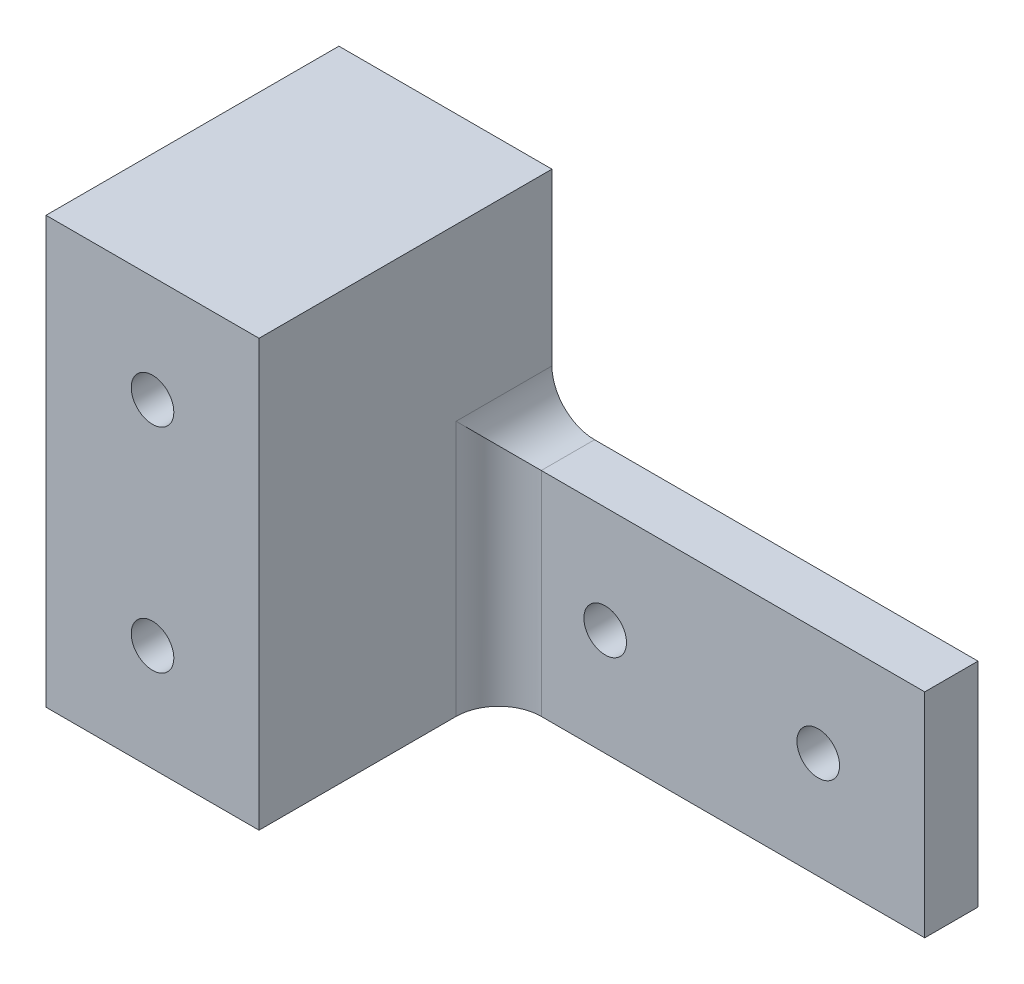
ISO-10303-21;
HEADER;
FILE_DESCRIPTION(('STEP AP214'),'2;1');
FILE_NAME('part.step','',(''),(''),'','','');
FILE_SCHEMA(('AUTOMOTIVE_DESIGN { 1 0 10303 214 1 1 1 1 }'));
ENDSEC;
DATA;
#1=APPLICATION_CONTEXT('core data for automotive mechanical design processes');
#2=APPLICATION_PROTOCOL_DEFINITION('international standard','automotive_design',2000,#1);
#3=PRODUCT_CONTEXT('',#1,'mechanical');
#4=PRODUCT('Part','Part','',(#3));
#5=PRODUCT_RELATED_PRODUCT_CATEGORY('part','',(#4));
#6=PRODUCT_DEFINITION_FORMATION('','',#4);
#7=PRODUCT_DEFINITION_CONTEXT('part definition',#1,'design');
#8=PRODUCT_DEFINITION('design','',#6,#7);
#9=PRODUCT_DEFINITION_SHAPE('','',#8);
#10=(LENGTH_UNIT() NAMED_UNIT(*) SI_UNIT(.MILLI.,.METRE.));
#11=(NAMED_UNIT(*) PLANE_ANGLE_UNIT() SI_UNIT($,.RADIAN.));
#12=(NAMED_UNIT(*) SI_UNIT($,.STERADIAN.) SOLID_ANGLE_UNIT());
#13=UNCERTAINTY_MEASURE_WITH_UNIT(LENGTH_MEASURE(1.E-05),#10,'distance_accuracy_value','');
#14=(GEOMETRIC_REPRESENTATION_CONTEXT(3) GLOBAL_UNCERTAINTY_ASSIGNED_CONTEXT((#13)) GLOBAL_UNIT_ASSIGNED_CONTEXT((#10,
#11,#12)) REPRESENTATION_CONTEXT('',''));
#15=CARTESIAN_POINT('',(0.,0.,0.));
#16=DIRECTION('',(0.,0.,1.));
#17=DIRECTION('',(1.,0.,0.));
#18=AXIS2_PLACEMENT_3D('',#15,#16,#17);
#19=CARTESIAN_POINT('',(12.7,38.1,0.));
#20=DIRECTION('',(0.,0.,1.));
#21=DIRECTION('',(1.,0.,0.));
#22=AXIS2_PLACEMENT_3D('',#19,#20,#21);
#23=CYLINDRICAL_SURFACE('',#22,2.54);
#24=CARTESIAN_POINT('',(12.7,38.1,34.925));
#25=DIRECTION('',(0.,0.,1.));
#26=DIRECTION('',(1.,0.,0.));
#27=AXIS2_PLACEMENT_3D('',#24,#25,#26);
#28=CIRCLE('',#27,2.54);
#29=CARTESIAN_POINT('',(15.24,38.1,34.925));
#30=VERTEX_POINT('',#29);
#31=EDGE_CURVE('E158',#30,#30,#28,.T.);
#32=ORIENTED_EDGE('',*,*,#31,.T.);
#33=EDGE_LOOP('',(#32));
#34=FACE_BOUND('',#33,.T.);
#35=CARTESIAN_POINT('',(12.7,38.1,22.225));
#36=DIRECTION('',(0.,0.,-1.));
#37=DIRECTION('',(-1.,0.,0.));
#38=AXIS2_PLACEMENT_3D('',#35,#36,#37);
#39=CIRCLE('',#38,2.54);
#40=CARTESIAN_POINT('',(10.16,38.1,22.225));
#41=VERTEX_POINT('',#40);
#42=EDGE_CURVE('E43',#41,#41,#39,.F.);
#43=ORIENTED_EDGE('',*,*,#42,.F.);
#44=EDGE_LOOP('',(#43));
#45=FACE_BOUND('',#44,.T.);
#46=ADVANCED_FACE('F39',(#34,#45),#23,.F.);
#47=CARTESIAN_POINT('',(76.2,0.,34.925));
#48=DIRECTION('',(0.,1.,0.));
#49=DIRECTION('',(-1.,0.,0.));
#50=AXIS2_PLACEMENT_3D('',#47,#48,#49);
#51=PLANE('',#50);
#52=DIRECTION('',(0.,0.,-1.));
#53=VECTOR('',#52,1.);
#54=CARTESIAN_POINT('',(76.2,0.,34.925));
#55=LINE('',#54,#53);
#56=CARTESIAN_POINT('',(76.2,0.,6.35));
#57=VERTEX_POINT('',#56);
#58=CARTESIAN_POINT('',(76.2,0.,0.));
#59=VERTEX_POINT('',#58);
#60=EDGE_CURVE('E181',#57,#59,#55,.T.);
#61=ORIENTED_EDGE('',*,*,#60,.F.);
#62=DIRECTION('',(1.,0.,0.));
#63=VECTOR('',#62,1.);
#64=CARTESIAN_POINT('',(76.2,0.,6.35));
#65=LINE('',#64,#63);
#66=CARTESIAN_POINT('',(30.48,0.,6.34999999999999));
#67=VERTEX_POINT('',#66);
#68=EDGE_CURVE('E131',#67,#57,#65,.T.);
#69=ORIENTED_EDGE('',*,*,#68,.F.);
#70=CARTESIAN_POINT('',(30.48,0.,11.43));
#71=DIRECTION('',(0.,1.,0.));
#72=DIRECTION('',(-1.,0.,0.));
#73=AXIS2_PLACEMENT_3D('',#70,#71,#72);
#74=CIRCLE('',#73,5.08);
#75=CARTESIAN_POINT('',(25.4,0.,11.43));
#76=VERTEX_POINT('',#75);
#77=EDGE_CURVE('E11',#67,#76,#74,.T.);
#78=ORIENTED_EDGE('',*,*,#77,.T.);
#79=DIRECTION('',(0.,0.,-1.));
#80=VECTOR('',#79,1.);
#81=CARTESIAN_POINT('',(25.4,0.,34.925));
#82=LINE('',#81,#80);
#83=CARTESIAN_POINT('',(25.4,0.,34.925));
#84=VERTEX_POINT('',#83);
#85=EDGE_CURVE('E113',#84,#76,#82,.T.);
#86=ORIENTED_EDGE('',*,*,#85,.F.);
#87=DIRECTION('',(1.,0.,0.));
#88=VECTOR('',#87,1.);
#89=CARTESIAN_POINT('',(76.2,0.,34.925));
#90=LINE('',#89,#88);
#91=CARTESIAN_POINT('',(0.,0.,34.925));
#92=VERTEX_POINT('',#91);
#93=EDGE_CURVE('E122',#92,#84,#90,.T.);
#94=ORIENTED_EDGE('',*,*,#93,.F.);
#95=DIRECTION('',(0.,0.,-1.));
#96=VECTOR('',#95,1.);
#97=CARTESIAN_POINT('',(0.,0.,34.925));
#98=LINE('',#97,#96);
#99=CARTESIAN_POINT('',(0.,0.,0.));
#100=VERTEX_POINT('',#99);
#101=EDGE_CURVE('E152',#92,#100,#98,.T.);
#102=ORIENTED_EDGE('',*,*,#101,.T.);
#103=DIRECTION('',(1.,0.,0.));
#104=VECTOR('',#103,1.);
#105=CARTESIAN_POINT('',(76.2,0.,0.));
#106=LINE('',#105,#104);
#107=EDGE_CURVE('E153',#100,#59,#106,.T.);
#108=ORIENTED_EDGE('',*,*,#107,.T.);
#109=EDGE_LOOP('',(#61,#69,#78,#86,#94,#102,#108));
#110=FACE_BOUND('',#109,.T.);
#111=ADVANCED_FACE('F127',(#110),#51,.F.);
#112=CARTESIAN_POINT('',(76.2,25.4,34.925));
#113=DIRECTION('',(-1.,0.,0.));
#114=DIRECTION('',(0.,0.,1.));
#115=AXIS2_PLACEMENT_3D('',#112,#113,#114);
#116=PLANE('',#115);
#117=DIRECTION('',(0.,0.,-1.));
#118=VECTOR('',#117,1.);
#119=CARTESIAN_POINT('',(76.2,25.4,34.925));
#120=LINE('',#119,#118);
#121=CARTESIAN_POINT('',(76.2,25.4,6.35));
#122=VERTEX_POINT('',#121);
#123=CARTESIAN_POINT('',(76.2,25.4,0.));
#124=VERTEX_POINT('',#123);
#125=EDGE_CURVE('E178',#122,#124,#120,.T.);
#126=ORIENTED_EDGE('',*,*,#125,.F.);
#127=DIRECTION('',(0.,-1.,0.));
#128=VECTOR('',#127,1.);
#129=CARTESIAN_POINT('',(76.2,50.8,6.35));
#130=LINE('',#129,#128);
#131=EDGE_CURVE('E190',#122,#57,#130,.T.);
#132=ORIENTED_EDGE('',*,*,#131,.T.);
#133=ORIENTED_EDGE('',*,*,#60,.T.);
#134=DIRECTION('',(0.,1.,0.));
#135=VECTOR('',#134,1.);
#136=CARTESIAN_POINT('',(76.2,25.4,0.));
#137=LINE('',#136,#135);
#138=EDGE_CURVE('E157',#59,#124,#137,.T.);
#139=ORIENTED_EDGE('',*,*,#138,.T.);
#140=EDGE_LOOP('',(#126,#132,#133,#139));
#141=FACE_BOUND('',#140,.T.);
#142=ADVANCED_FACE('F277',(#141),#116,.F.);
#143=CARTESIAN_POINT('',(25.4,25.4,34.925));
#144=DIRECTION('',(0.,-1.,0.));
#145=DIRECTION('',(1.,0.,0.));
#146=AXIS2_PLACEMENT_3D('',#143,#144,#145);
#147=PLANE('',#146);
#148=DIRECTION('',(-1.,0.,0.));
#149=VECTOR('',#148,1.);
#150=CARTESIAN_POINT('',(25.4,25.4,0.));
#151=LINE('',#150,#149);
#152=CARTESIAN_POINT('',(30.48,25.4,0.));
#153=VERTEX_POINT('',#152);
#154=EDGE_CURVE('E162',#124,#153,#151,.T.);
#155=ORIENTED_EDGE('',*,*,#154,.T.);
#156=DIRECTION('',(0.,0.,-1.));
#157=VECTOR('',#156,1.);
#158=CARTESIAN_POINT('',(30.48,25.4,6.34999999999999));
#159=LINE('',#158,#157);
#160=CARTESIAN_POINT('',(30.48,25.4,6.34999999999999));
#161=VERTEX_POINT('',#160);
#162=EDGE_CURVE('E197',#153,#161,#159,.F.);
#163=ORIENTED_EDGE('',*,*,#162,.T.);
#164=DIRECTION('',(1.,0.,0.));
#165=VECTOR('',#164,1.);
#166=CARTESIAN_POINT('',(25.4,25.4,6.34999999999999));
#167=LINE('',#166,#165);
#168=EDGE_CURVE('E232',#161,#122,#167,.T.);
#169=ORIENTED_EDGE('',*,*,#168,.T.);
#170=ORIENTED_EDGE('',*,*,#125,.T.);
#171=EDGE_LOOP('',(#155,#163,#169,#170));
#172=FACE_BOUND('',#171,.T.);
#173=ADVANCED_FACE('F310',(#172),#147,.F.);
#174=CARTESIAN_POINT('',(25.4,50.8,34.925));
#175=DIRECTION('',(-1.,0.,0.));
#176=DIRECTION('',(0.,-1.,0.));
#177=AXIS2_PLACEMENT_3D('',#174,#175,#176);
#178=PLANE('',#177);
#179=DIRECTION('',(0.,-1.,0.));
#180=VECTOR('',#179,1.);
#181=CARTESIAN_POINT('',(25.4,25.4,11.43));
#182=LINE('',#181,#180);
#183=CARTESIAN_POINT('',(25.4,30.48,11.43));
#184=VERTEX_POINT('',#183);
#185=EDGE_CURVE('E184',#76,#184,#182,.F.);
#186=ORIENTED_EDGE('',*,*,#185,.T.);
#187=DIRECTION('',(0.,0.,-1.));
#188=VECTOR('',#187,1.);
#189=CARTESIAN_POINT('',(25.4,30.48,0.));
#190=LINE('',#189,#188);
#191=CARTESIAN_POINT('',(25.4,30.48,0.));
#192=VERTEX_POINT('',#191);
#193=EDGE_CURVE('E193',#184,#192,#190,.T.);
#194=ORIENTED_EDGE('',*,*,#193,.T.);
#195=DIRECTION('',(0.,1.,0.));
#196=VECTOR('',#195,1.);
#197=CARTESIAN_POINT('',(25.4,50.8,0.));
#198=LINE('',#197,#196);
#199=CARTESIAN_POINT('',(25.4,50.8,0.));
#200=VERTEX_POINT('',#199);
#201=EDGE_CURVE('E165',#192,#200,#198,.T.);
#202=ORIENTED_EDGE('',*,*,#201,.T.);
#203=DIRECTION('',(0.,0.,-1.));
#204=VECTOR('',#203,1.);
#205=CARTESIAN_POINT('',(25.4,50.8,34.925));
#206=LINE('',#205,#204);
#207=CARTESIAN_POINT('',(25.4,50.8,34.925));
#208=VERTEX_POINT('',#207);
#209=EDGE_CURVE('E116',#208,#200,#206,.T.);
#210=ORIENTED_EDGE('',*,*,#209,.F.);
#211=DIRECTION('',(0.,1.,0.));
#212=VECTOR('',#211,1.);
#213=CARTESIAN_POINT('',(25.4,50.8,34.925));
#214=LINE('',#213,#212);
#215=EDGE_CURVE('E110',#84,#208,#214,.T.);
#216=ORIENTED_EDGE('',*,*,#215,.F.);
#217=ORIENTED_EDGE('',*,*,#85,.T.);
#218=EDGE_LOOP('',(#186,#194,#202,#210,#216,#217));
#219=FACE_BOUND('',#218,.T.);
#220=ADVANCED_FACE('F112',(#219),#178,.F.);
#221=CARTESIAN_POINT('',(0.,50.8,34.925));
#222=DIRECTION('',(0.,-1.,0.));
#223=DIRECTION('',(0.,0.,-1.));
#224=AXIS2_PLACEMENT_3D('',#221,#222,#223);
#225=PLANE('',#224);
#226=DIRECTION('',(-1.,0.,0.));
#227=VECTOR('',#226,1.);
#228=CARTESIAN_POINT('',(0.,50.8,0.));
#229=LINE('',#228,#227);
#230=CARTESIAN_POINT('',(0.,50.8,0.));
#231=VERTEX_POINT('',#230);
#232=EDGE_CURVE('E142',#200,#231,#229,.T.);
#233=ORIENTED_EDGE('',*,*,#232,.T.);
#234=DIRECTION('',(0.,0.,-1.));
#235=VECTOR('',#234,1.);
#236=CARTESIAN_POINT('',(0.,50.8,34.925));
#237=LINE('',#236,#235);
#238=CARTESIAN_POINT('',(0.,50.8,34.925));
#239=VERTEX_POINT('',#238);
#240=EDGE_CURVE('E172',#239,#231,#237,.T.);
#241=ORIENTED_EDGE('',*,*,#240,.F.);
#242=DIRECTION('',(-1.,0.,0.));
#243=VECTOR('',#242,1.);
#244=CARTESIAN_POINT('',(0.,50.8,34.925));
#245=LINE('',#244,#243);
#246=EDGE_CURVE('E121',#208,#239,#245,.T.);
#247=ORIENTED_EDGE('',*,*,#246,.F.);
#248=ORIENTED_EDGE('',*,*,#209,.T.);
#249=EDGE_LOOP('',(#233,#241,#247,#248));
#250=FACE_BOUND('',#249,.T.);
#251=ADVANCED_FACE('F300',(#250),#225,.F.);
#252=CARTESIAN_POINT('',(0.,0.,34.925));
#253=DIRECTION('',(1.,0.,0.));
#254=DIRECTION('',(0.,0.,-1.));
#255=AXIS2_PLACEMENT_3D('',#252,#253,#254);
#256=PLANE('',#255);
#257=DIRECTION('',(0.,-1.,0.));
#258=VECTOR('',#257,1.);
#259=CARTESIAN_POINT('',(0.,0.,0.));
#260=LINE('',#259,#258);
#261=EDGE_CURVE('E139',#231,#100,#260,.T.);
#262=ORIENTED_EDGE('',*,*,#261,.T.);
#263=ORIENTED_EDGE('',*,*,#101,.F.);
#264=DIRECTION('',(0.,-1.,0.));
#265=VECTOR('',#264,1.);
#266=CARTESIAN_POINT('',(0.,0.,34.925));
#267=LINE('',#266,#265);
#268=EDGE_CURVE('E136',#239,#92,#267,.T.);
#269=ORIENTED_EDGE('',*,*,#268,.F.);
#270=ORIENTED_EDGE('',*,*,#240,.T.);
#271=EDGE_LOOP('',(#262,#263,#269,#270));
#272=FACE_BOUND('',#271,.T.);
#273=ADVANCED_FACE('F295',(#272),#256,.F.);
#274=CARTESIAN_POINT('',(0.,0.,34.925));
#275=DIRECTION('',(0.,0.,-1.));
#276=DIRECTION('',(-1.,0.,0.));
#277=AXIS2_PLACEMENT_3D('',#274,#275,#276);
#278=PLANE('',#277);
#279=ORIENTED_EDGE('',*,*,#31,.F.);
#280=EDGE_LOOP('',(#279));
#281=FACE_BOUND('',#280,.T.);
#282=CARTESIAN_POINT('',(12.7,12.7,34.925));
#283=DIRECTION('',(0.,0.,1.));
#284=DIRECTION('',(1.,0.,0.));
#285=AXIS2_PLACEMENT_3D('',#282,#283,#284);
#286=CIRCLE('',#285,2.54);
#287=CARTESIAN_POINT('',(15.24,12.7,34.925));
#288=VERTEX_POINT('',#287);
#289=EDGE_CURVE('E242',#288,#288,#286,.T.);
#290=ORIENTED_EDGE('',*,*,#289,.F.);
#291=EDGE_LOOP('',(#290));
#292=FACE_BOUND('',#291,.T.);
#293=ORIENTED_EDGE('',*,*,#93,.T.);
#294=ORIENTED_EDGE('',*,*,#215,.T.);
#295=ORIENTED_EDGE('',*,*,#246,.T.);
#296=ORIENTED_EDGE('',*,*,#268,.T.);
#297=EDGE_LOOP('',(#293,#294,#295,#296));
#298=FACE_BOUND('',#297,.T.);
#299=ADVANCED_FACE('F134',(#281,#292,#298),#278,.F.);
#300=CARTESIAN_POINT('',(0.,0.,0.));
#301=DIRECTION('',(0.,0.,-1.));
#302=DIRECTION('',(-1.,0.,0.));
#303=AXIS2_PLACEMENT_3D('',#300,#301,#302);
#304=PLANE('',#303);
#305=CARTESIAN_POINT('',(12.7,38.1,0.));
#306=DIRECTION('',(0.,0.,-1.));
#307=DIRECTION('',(-1.,0.,0.));
#308=AXIS2_PLACEMENT_3D('',#305,#306,#307);
#309=CIRCLE('',#308,6.35);
#310=CARTESIAN_POINT('',(6.35,38.1,0.));
#311=VERTEX_POINT('',#310);
#312=EDGE_CURVE('E216',#311,#311,#309,.T.);
#313=ORIENTED_EDGE('',*,*,#312,.F.);
#314=EDGE_LOOP('',(#313));
#315=FACE_BOUND('',#314,.T.);
#316=CARTESIAN_POINT('',(12.7,12.7,0.));
#317=DIRECTION('',(0.,0.,1.));
#318=DIRECTION('',(1.,0.,0.));
#319=AXIS2_PLACEMENT_3D('',#316,#317,#318);
#320=CIRCLE('',#319,2.54);
#321=CARTESIAN_POINT('',(15.24,12.7,0.));
#322=VERTEX_POINT('',#321);
#323=EDGE_CURVE('E238',#322,#322,#320,.T.);
#324=ORIENTED_EDGE('',*,*,#323,.T.);
#325=EDGE_LOOP('',(#324));
#326=FACE_BOUND('',#325,.T.);
#327=CARTESIAN_POINT('',(38.1,12.7,0.));
#328=DIRECTION('',(0.,0.,1.));
#329=DIRECTION('',(1.,0.,0.));
#330=AXIS2_PLACEMENT_3D('',#327,#328,#329);
#331=CIRCLE('',#330,2.54);
#332=CARTESIAN_POINT('',(40.64,12.7,0.));
#333=VERTEX_POINT('',#332);
#334=EDGE_CURVE('E245',#333,#333,#331,.T.);
#335=ORIENTED_EDGE('',*,*,#334,.T.);
#336=EDGE_LOOP('',(#335));
#337=FACE_BOUND('',#336,.T.);
#338=CARTESIAN_POINT('',(63.5,12.7,0.));
#339=DIRECTION('',(0.,0.,1.));
#340=DIRECTION('',(1.,0.,0.));
#341=AXIS2_PLACEMENT_3D('',#338,#339,#340);
#342=CIRCLE('',#341,2.54);
#343=CARTESIAN_POINT('',(66.04,12.7,0.));
#344=VERTEX_POINT('',#343);
#345=EDGE_CURVE('E145',#344,#344,#342,.T.);
#346=ORIENTED_EDGE('',*,*,#345,.T.);
#347=EDGE_LOOP('',(#346));
#348=FACE_BOUND('',#347,.T.);
#349=ORIENTED_EDGE('',*,*,#107,.F.);
#350=ORIENTED_EDGE('',*,*,#261,.F.);
#351=ORIENTED_EDGE('',*,*,#232,.F.);
#352=ORIENTED_EDGE('',*,*,#201,.F.);
#353=CARTESIAN_POINT('',(30.48,30.48,0.));
#354=DIRECTION('',(0.,0.,-1.));
#355=DIRECTION('',(-1.,0.,0.));
#356=AXIS2_PLACEMENT_3D('',#353,#354,#355);
#357=CIRCLE('',#356,5.08);
#358=EDGE_CURVE('E49',#192,#153,#357,.F.);
#359=ORIENTED_EDGE('',*,*,#358,.T.);
#360=ORIENTED_EDGE('',*,*,#154,.F.);
#361=ORIENTED_EDGE('',*,*,#138,.F.);
#362=EDGE_LOOP('',(#349,#350,#351,#352,#359,#360,#361));
#363=FACE_BOUND('',#362,.T.);
#364=ADVANCED_FACE('F254',(#315,#326,#337,#348,#363),#304,.T.);
#365=CARTESIAN_POINT('',(63.5,12.7,0.));
#366=DIRECTION('',(0.,0.,1.));
#367=DIRECTION('',(1.,0.,0.));
#368=AXIS2_PLACEMENT_3D('',#365,#366,#367);
#369=CYLINDRICAL_SURFACE('',#368,2.54);
#370=CARTESIAN_POINT('',(63.5,12.7,6.35));
#371=DIRECTION('',(0.,0.,-1.));
#372=DIRECTION('',(-1.,0.,0.));
#373=AXIS2_PLACEMENT_3D('',#370,#371,#372);
#374=CIRCLE('',#373,2.54);
#375=CARTESIAN_POINT('',(60.96,12.7,6.35));
#376=VERTEX_POINT('',#375);
#377=EDGE_CURVE('E189',#376,#376,#374,.F.);
#378=ORIENTED_EDGE('',*,*,#377,.T.);
#379=EDGE_LOOP('',(#378));
#380=FACE_BOUND('',#379,.T.);
#381=ORIENTED_EDGE('',*,*,#345,.F.);
#382=EDGE_LOOP('',(#381));
#383=FACE_BOUND('',#382,.T.);
#384=ADVANCED_FACE('F256',(#380,#383),#369,.F.);
#385=CARTESIAN_POINT('',(38.1,12.7,0.));
#386=DIRECTION('',(0.,0.,1.));
#387=DIRECTION('',(1.,0.,0.));
#388=AXIS2_PLACEMENT_3D('',#385,#386,#387);
#389=CYLINDRICAL_SURFACE('',#388,2.54);
#390=CARTESIAN_POINT('',(38.1,12.7,6.35));
#391=DIRECTION('',(0.,0.,-1.));
#392=DIRECTION('',(-1.,0.,0.));
#393=AXIS2_PLACEMENT_3D('',#390,#391,#392);
#394=CIRCLE('',#393,2.54);
#395=CARTESIAN_POINT('',(35.56,12.7,6.35));
#396=VERTEX_POINT('',#395);
#397=EDGE_CURVE('E185',#396,#396,#394,.F.);
#398=ORIENTED_EDGE('',*,*,#397,.T.);
#399=EDGE_LOOP('',(#398));
#400=FACE_BOUND('',#399,.T.);
#401=ORIENTED_EDGE('',*,*,#334,.F.);
#402=EDGE_LOOP('',(#401));
#403=FACE_BOUND('',#402,.T.);
#404=ADVANCED_FACE('F258',(#400,#403),#389,.F.);
#405=CARTESIAN_POINT('',(12.7,12.7,0.));
#406=DIRECTION('',(0.,0.,1.));
#407=DIRECTION('',(1.,0.,0.));
#408=AXIS2_PLACEMENT_3D('',#405,#406,#407);
#409=CYLINDRICAL_SURFACE('',#408,2.54);
#410=ORIENTED_EDGE('',*,*,#323,.F.);
#411=EDGE_LOOP('',(#410));
#412=FACE_BOUND('',#411,.T.);
#413=ORIENTED_EDGE('',*,*,#289,.T.);
#414=EDGE_LOOP('',(#413));
#415=FACE_BOUND('',#414,.T.);
#416=ADVANCED_FACE('F265',(#412,#415),#409,.F.);
#417=CARTESIAN_POINT('',(76.2,50.8,6.35));
#418=DIRECTION('',(0.,0.,-1.));
#419=DIRECTION('',(-1.,0.,0.));
#420=AXIS2_PLACEMENT_3D('',#417,#418,#419);
#421=PLANE('',#420);
#422=ORIENTED_EDGE('',*,*,#397,.F.);
#423=EDGE_LOOP('',(#422));
#424=FACE_BOUND('',#423,.T.);
#425=ORIENTED_EDGE('',*,*,#377,.F.);
#426=EDGE_LOOP('',(#425));
#427=FACE_BOUND('',#426,.T.);
#428=ORIENTED_EDGE('',*,*,#168,.F.);
#429=DIRECTION('',(0.,-1.,0.));
#430=VECTOR('',#429,1.);
#431=CARTESIAN_POINT('',(30.48,0.,6.34999999999999));
#432=LINE('',#431,#430);
#433=EDGE_CURVE('E57',#161,#67,#432,.T.);
#434=ORIENTED_EDGE('',*,*,#433,.T.);
#435=ORIENTED_EDGE('',*,*,#68,.T.);
#436=ORIENTED_EDGE('',*,*,#131,.F.);
#437=EDGE_LOOP('',(#428,#434,#435,#436));
#438=FACE_BOUND('',#437,.T.);
#439=ADVANCED_FACE('F282',(#424,#427,#438),#421,.F.);
#440=CARTESIAN_POINT('',(30.48,50.8,11.43));
#441=DIRECTION('',(0.,1.,0.));
#442=DIRECTION('',(-1.,0.,0.));
#443=AXIS2_PLACEMENT_3D('',#440,#441,#442);
#444=CYLINDRICAL_SURFACE('',#443,5.08);
#445=ORIENTED_EDGE('',*,*,#77,.F.);
#446=ORIENTED_EDGE('',*,*,#433,.F.);
#447=CARTESIAN_POINT('',(30.48,30.48,11.43));
#448=DIRECTION('',(0.,0.707106781186547,-0.707106781186547));
#449=DIRECTION('',(0.,0.707106781186547,0.707106781186547));
#450=AXIS2_PLACEMENT_3D('',#447,#448,#449);
#451=ELLIPSE('',#450,7.18420489685532,5.08);
#452=EDGE_CURVE('E132',#184,#161,#451,.F.);
#453=ORIENTED_EDGE('',*,*,#452,.F.);
#454=ORIENTED_EDGE('',*,*,#185,.F.);
#455=EDGE_LOOP('',(#445,#446,#453,#454));
#456=FACE_BOUND('',#455,.T.);
#457=ADVANCED_FACE('F41',(#456),#444,.F.);
#458=CARTESIAN_POINT('',(30.48,30.48,34.925));
#459=DIRECTION('',(0.,0.,1.));
#460=DIRECTION('',(1.,0.,0.));
#461=AXIS2_PLACEMENT_3D('',#458,#459,#460);
#462=CYLINDRICAL_SURFACE('',#461,5.08);
#463=ORIENTED_EDGE('',*,*,#452,.T.);
#464=ORIENTED_EDGE('',*,*,#162,.F.);
#465=ORIENTED_EDGE('',*,*,#358,.F.);
#466=ORIENTED_EDGE('',*,*,#193,.F.);
#467=EDGE_LOOP('',(#463,#464,#465,#466));
#468=FACE_BOUND('',#467,.T.);
#469=ADVANCED_FACE('F316',(#468),#462,.F.);
#470=CARTESIAN_POINT('',(12.7,38.1,22.225));
#471=DIRECTION('',(0.,0.,-1.));
#472=DIRECTION('',(-1.,0.,0.));
#473=AXIS2_PLACEMENT_3D('',#470,#471,#472);
#474=PLANE('',#473);
#475=CARTESIAN_POINT('',(12.7,38.1,22.225));
#476=DIRECTION('',(0.,0.,-1.));
#477=DIRECTION('',(-1.,0.,0.));
#478=AXIS2_PLACEMENT_3D('',#475,#476,#477);
#479=CIRCLE('',#478,6.35);
#480=CARTESIAN_POINT('',(6.35,38.1,22.225));
#481=VERTEX_POINT('',#480);
#482=EDGE_CURVE('E211',#481,#481,#479,.T.);
#483=ORIENTED_EDGE('',*,*,#482,.T.);
#484=EDGE_LOOP('',(#483));
#485=FACE_BOUND('',#484,.T.);
#486=ORIENTED_EDGE('',*,*,#42,.T.);
#487=EDGE_LOOP('',(#486));
#488=FACE_BOUND('',#487,.T.);
#489=ADVANCED_FACE('F318',(#485,#488),#474,.T.);
#490=CARTESIAN_POINT('',(12.7,38.1,22.225));
#491=DIRECTION('',(0.,0.,-1.));
#492=DIRECTION('',(-1.,0.,0.));
#493=AXIS2_PLACEMENT_3D('',#490,#491,#492);
#494=CYLINDRICAL_SURFACE('',#493,6.35);
#495=ORIENTED_EDGE('',*,*,#482,.F.);
#496=EDGE_LOOP('',(#495));
#497=FACE_BOUND('',#496,.T.);
#498=ORIENTED_EDGE('',*,*,#312,.T.);
#499=EDGE_LOOP('',(#498));
#500=FACE_BOUND('',#499,.T.);
#501=ADVANCED_FACE('F323',(#497,#500),#494,.F.);
#502=CLOSED_SHELL('',(#46,#111,#142,#173,#220,#251,#273,#299,#364,#384,#404,#416,#439,#457,#469,
#489,#501));
#503=MANIFOLD_SOLID_BREP('B2',#502);
#504=ADVANCED_BREP_SHAPE_REPRESENTATION('',(#18,#503),#14);
#505=SHAPE_DEFINITION_REPRESENTATION(#9,#504);
ENDSEC;
END-ISO-10303-21;
